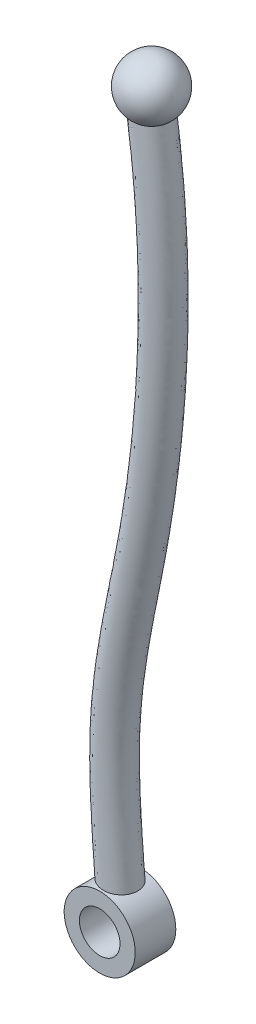
ISO-10303-21;
HEADER;
FILE_DESCRIPTION(('STEP AP214'),'2;1');
FILE_NAME('part.step','',(''),(''),'','','');
FILE_SCHEMA(('AUTOMOTIVE_DESIGN { 1 0 10303 214 1 1 1 1 }'));
ENDSEC;
DATA;
#1=APPLICATION_CONTEXT('core data for automotive mechanical design processes');
#2=APPLICATION_PROTOCOL_DEFINITION('international standard','automotive_design',2000,#1);
#3=PRODUCT_CONTEXT('',#1,'mechanical');
#4=PRODUCT('Part','Part','',(#3));
#5=PRODUCT_RELATED_PRODUCT_CATEGORY('part','',(#4));
#6=PRODUCT_DEFINITION_FORMATION('','',#4);
#7=PRODUCT_DEFINITION_CONTEXT('part definition',#1,'design');
#8=PRODUCT_DEFINITION('design','',#6,#7);
#9=PRODUCT_DEFINITION_SHAPE('','',#8);
#10=(LENGTH_UNIT() NAMED_UNIT(*) SI_UNIT(.MILLI.,.METRE.));
#11=(NAMED_UNIT(*) PLANE_ANGLE_UNIT() SI_UNIT($,.RADIAN.));
#12=(NAMED_UNIT(*) SI_UNIT($,.STERADIAN.) SOLID_ANGLE_UNIT());
#13=UNCERTAINTY_MEASURE_WITH_UNIT(LENGTH_MEASURE(1.E-05),#10,'distance_accuracy_value','');
#14=(GEOMETRIC_REPRESENTATION_CONTEXT(3) GLOBAL_UNCERTAINTY_ASSIGNED_CONTEXT((#13)) GLOBAL_UNIT_ASSIGNED_CONTEXT((#10,
#11,#12)) REPRESENTATION_CONTEXT('',''));
#15=CARTESIAN_POINT('',(0.,0.,0.));
#16=DIRECTION('',(0.,0.,1.));
#17=DIRECTION('',(1.,0.,0.));
#18=AXIS2_PLACEMENT_3D('',#15,#16,#17);
#19=CARTESIAN_POINT('',(0.,-7.,3.86221657162284));
#20=DIRECTION('',(0.,-1.,0.));
#21=DIRECTION('',(0.,0.,-1.));
#22=AXIS2_PLACEMENT_3D('',#19,#20,#21);
#23=PLANE('',#22);
#24=CARTESIAN_POINT('',(0.,-7.,4.));
#25=DIRECTION('',(0.,1.,0.));
#26=DIRECTION('',(0.,0.,1.));
#27=AXIS2_PLACEMENT_3D('',#24,#25,#26);
#28=CIRCLE('',#27,0.137783428377159);
#29=CARTESIAN_POINT('',(0.,-7.,4.13778342837716));
#30=VERTEX_POINT('',#29);
#31=EDGE_CURVE('E66',#30,#30,#28,.T.);
#32=ORIENTED_EDGE('',*,*,#31,.T.);
#33=EDGE_LOOP('',(#32));
#34=FACE_BOUND('',#33,.T.);
#35=ADVANCED_FACE('F60',(#34),#23,.F.);
#36=CARTESIAN_POINT('',(0.,-7.1945013331869,4.));
#37=DIRECTION('',(0.,1.,0.));
#38=DIRECTION('',(0.,0.,1.));
#39=AXIS2_PLACEMENT_3D('',#36,#37,#38);
#40=PLANE('',#39);
#41=CARTESIAN_POINT('',(0.,-7.1945013331869,4.));
#42=DIRECTION('',(0.,1.,0.));
#43=DIRECTION('',(0.,0.,1.));
#44=AXIS2_PLACEMENT_3D('',#41,#42,#43);
#45=CIRCLE('',#44,0.137783428377159);
#46=CARTESIAN_POINT('',(0.,-7.1945013331869,4.13778342837716));
#47=VERTEX_POINT('',#46);
#48=EDGE_CURVE('E12',#47,#47,#45,.T.);
#49=ORIENTED_EDGE('',*,*,#48,.F.);
#50=EDGE_LOOP('',(#49));
#51=FACE_BOUND('',#50,.T.);
#52=ADVANCED_FACE('F75',(#51),#40,.F.);
#53=CARTESIAN_POINT('',(0.,-7.,4.));
#54=DIRECTION('',(0.,1.,0.));
#55=DIRECTION('',(0.,0.,1.));
#56=AXIS2_PLACEMENT_3D('',#53,#54,#55);
#57=CYLINDRICAL_SURFACE('',#56,0.137783428377159);
#58=ORIENTED_EDGE('',*,*,#31,.F.);
#59=EDGE_LOOP('',(#58));
#60=FACE_BOUND('',#59,.T.);
#61=ORIENTED_EDGE('',*,*,#48,.T.);
#62=EDGE_LOOP('',(#61));
#63=FACE_BOUND('',#62,.T.);
#64=ADVANCED_FACE('F73',(#60,#63),#57,.T.);
#65=CLOSED_SHELL('',(#35,#52,#64));
#66=MANIFOLD_SOLID_BREP('B2',#65);
#67=CARTESIAN_POINT('',(0.,0.,8.));
#68=DIRECTION('',(0.,0.,-1.));
#69=DIRECTION('',(-1.,0.,0.));
#70=AXIS2_PLACEMENT_3D('',#67,#68,#69);
#71=CYLINDRICAL_SURFACE('',#70,7.);
#72=CARTESIAN_POINT('',(0.,0.,0.));
#73=DIRECTION('',(0.,0.,1.));
#74=DIRECTION('',(1.,0.,0.));
#75=AXIS2_PLACEMENT_3D('',#72,#73,#74);
#76=CIRCLE('',#75,7.);
#77=CARTESIAN_POINT('',(7.,0.,0.));
#78=VERTEX_POINT('',#77);
#79=EDGE_CURVE('E146',#78,#78,#76,.T.);
#80=ORIENTED_EDGE('',*,*,#79,.T.);
#81=EDGE_LOOP('',(#80));
#82=FACE_BOUND('',#81,.T.);
#83=CARTESIAN_POINT('',(0.,0.,8.));
#84=DIRECTION('',(0.,0.,1.));
#85=DIRECTION('',(1.,0.,0.));
#86=AXIS2_PLACEMENT_3D('',#83,#84,#85);
#87=CIRCLE('',#86,7.);
#88=CARTESIAN_POINT('',(7.,0.,8.));
#89=VERTEX_POINT('',#88);
#90=EDGE_CURVE('E135',#89,#89,#87,.T.);
#91=ORIENTED_EDGE('',*,*,#90,.F.);
#92=EDGE_LOOP('',(#91));
#93=FACE_BOUND('',#92,.T.);
#94=CARTESIAN_POINT('',(2.42365806243927E-09,7.,7.5));
#95=CARTESIAN_POINT('',(0.0422400356138431,7.00000076805746,7.50000073274698));
#96=CARTESIAN_POINT('',(0.0844796114102227,6.9996176935888,7.49922288932425));
#97=CARTESIAN_POINT('',(0.16868741892609,6.99809306650622,7.49612927228377));
#98=CARTESIAN_POINT('',(0.210655985432426,6.99695513154904,7.49382083404208));
#99=CARTESIAN_POINT('',(0.294323815693168,6.99393459760473,7.4876945756797));
#100=CARTESIAN_POINT('',(0.336023511149844,6.99205433473992,7.48388149073423));
#101=CARTESIAN_POINT('',(0.419155721375281,6.98756312538778,7.47476917137856));
#102=CARTESIAN_POINT('',(0.460588547421802,6.98495330180796,7.46947222084216));
#103=CARTESIAN_POINT('',(0.54318327893848,6.97901612384671,7.45740978161843));
#104=CARTESIAN_POINT('',(0.584345213643453,6.97568884824667,7.45064445416889));
#105=CARTESIAN_POINT('',(0.666408373617677,6.96832834444628,7.43565524670615));
#106=CARTESIAN_POINT('',(0.707309068106672,6.96429398061942,7.42742902011428));
#107=CARTESIAN_POINT('',(0.788851812160291,6.95553010718593,7.40952236378143));
#108=CARTESIAN_POINT('',(0.829492642778194,6.95079845000549,7.39983743933177));
#109=CARTESIAN_POINT('',(0.910517436434897,6.94065089772847,7.37901231997466));
#110=CARTESIAN_POINT('',(0.950899335048052,6.93523193208417,7.36786558633951));
#111=CARTESIAN_POINT('',(0.991029119954068,6.92949213713946,7.35602293267703));
#112=B_SPLINE_CURVE_WITH_KNOTS('',3,(#94,#95,#96,#97,#98,#99,#100,#101,#102,#103,#104,#105,#106,
#107,#108,#109,#110,#111),.UNSPECIFIED.,.F.,.F.,(4,2,2,2,2,2,2,2,4),(0.,0.126710488419665,
0.252818064152274,0.378531900178072,0.504053298430019,0.629560920543931,0.755271994166555,
0.881378662671853,1.00806998450979),.UNSPECIFIED.);
#113=CARTESIAN_POINT('',(0.,7.,7.5));
#114=VERTEX_POINT('',#113);
#115=CARTESIAN_POINT('',(0.991029122350048,6.92949213713776,7.35602293197301));
#116=VERTEX_POINT('',#115);
#117=EDGE_CURVE('E58',#114,#116,#112,.T.);
#118=ORIENTED_EDGE('',*,*,#117,.F.);
#119=DIRECTION('',(0.,0.,-1.));
#120=VECTOR('',#119,1.);
#121=CARTESIAN_POINT('',(0.,7.,8.));
#122=LINE('',#121,#120);
#123=CARTESIAN_POINT('',(0.,7.,0.500000000000001));
#124=VERTEX_POINT('',#123);
#125=EDGE_CURVE('E109',#114,#124,#122,.T.);
#126=ORIENTED_EDGE('',*,*,#125,.T.);
#127=CARTESIAN_POINT('',(0.99102911996432,6.92949213747896,0.643977067322961));
#128=CARTESIAN_POINT('',(0.950899335035006,6.93523193220807,0.632134413655968));
#129=CARTESIAN_POINT('',(0.910517436414653,6.94065089776374,0.620987680019741));
#130=CARTESIAN_POINT('',(0.829492642755576,6.95079844997574,0.600162560662808));
#131=CARTESIAN_POINT('',(0.788851812142409,6.95553010717923,0.590477636214458));
#132=CARTESIAN_POINT('',(0.707309068095003,6.96429398062927,0.572570979883343));
#133=CARTESIAN_POINT('',(0.6664083736075,6.96832834444972,0.5643447532919));
#134=CARTESIAN_POINT('',(0.584345213637771,6.97568884824466,0.549355545830163));
#135=CARTESIAN_POINT('',(0.543183278935804,6.97901612384566,0.54259021838118));
#136=CARTESIAN_POINT('',(0.460588547423475,6.98495330180909,0.530527779158093));
#137=CARTESIAN_POINT('',(0.41915572137829,6.98756312539012,0.52523082862183));
#138=CARTESIAN_POINT('',(0.336023511156024,6.99205433473708,0.516118509266392));
#139=CARTESIAN_POINT('',(0.294323815701186,6.99393459759551,0.512305424321015));
#140=CARTESIAN_POINT('',(0.210655985444895,6.99695513155755,0.506179165958709));
#141=CARTESIAN_POINT('',(0.168687418941174,6.99809306653893,0.503870727716985));
#142=CARTESIAN_POINT('',(0.0844796114269324,6.99961769355535,0.50077711067617));
#143=CARTESIAN_POINT('',(0.042240035629553,7.00000076793306,0.499999267253231));
#144=CARTESIAN_POINT('',(2.43718194990733E-09,6.99999999965321,0.500000000000002));
#145=B_SPLINE_CURVE_WITH_KNOTS('',3,(#127,#128,#129,#130,#131,#132,#133,#134,#135,#136,#137,
#138,#139,#140,#141,#142,#143,#144),.UNSPECIFIED.,.F.,.F.,(4,2,2,2,2,2,2,2,4),(0.,
0.126691321825357,0.252797990324944,0.378509063940461,0.504016686045815,0.629538084293607,
0.755251920313766,0.881359496039202,1.0080699844594),.UNSPECIFIED.);
#146=CARTESIAN_POINT('',(0.99102911996432,6.92949213747896,0.643977067322961));
#147=VERTEX_POINT('',#146);
#148=EDGE_CURVE('E124',#147,#124,#145,.T.);
#149=ORIENTED_EDGE('',*,*,#148,.F.);
#150=DIRECTION('',(0.,0.,-1.));
#151=VECTOR('',#150,1.);
#152=CARTESIAN_POINT('',(0.991029122350048,6.92949213713776,8.));
#153=LINE('',#152,#151);
#154=EDGE_CURVE('E119',#147,#116,#153,.F.);
#155=ORIENTED_EDGE('',*,*,#154,.T.);
#156=EDGE_LOOP('',(#118,#126,#149,#155));
#157=FACE_BOUND('',#156,.T.);
#158=ADVANCED_FACE('F100',(#82,#93,#157),#71,.T.);
#159=CARTESIAN_POINT('',(0.,0.,8.));
#160=DIRECTION('',(0.,0.,1.));
#161=DIRECTION('',(1.,0.,0.));
#162=AXIS2_PLACEMENT_3D('',#159,#160,#161);
#163=PLANE('',#162);
#164=CARTESIAN_POINT('',(0.,0.,8.));
#165=DIRECTION('',(0.,0.,1.));
#166=DIRECTION('',(1.,0.,0.));
#167=AXIS2_PLACEMENT_3D('',#164,#165,#166);
#168=CIRCLE('',#167,4.);
#169=CARTESIAN_POINT('',(4.,0.,8.));
#170=VERTEX_POINT('',#169);
#171=EDGE_CURVE('E138',#170,#170,#168,.T.);
#172=ORIENTED_EDGE('',*,*,#171,.F.);
#173=EDGE_LOOP('',(#172));
#174=FACE_BOUND('',#173,.T.);
#175=ORIENTED_EDGE('',*,*,#90,.T.);
#176=EDGE_LOOP('',(#175));
#177=FACE_BOUND('',#176,.T.);
#178=ADVANCED_FACE('F182',(#174,#177),#163,.T.);
#179=CARTESIAN_POINT('',(0.,0.,0.));
#180=DIRECTION('',(0.,0.,1.));
#181=DIRECTION('',(1.,0.,0.));
#182=AXIS2_PLACEMENT_3D('',#179,#180,#181);
#183=PLANE('',#182);
#184=CARTESIAN_POINT('',(0.,0.,0.));
#185=DIRECTION('',(0.,0.,1.));
#186=DIRECTION('',(1.,0.,0.));
#187=AXIS2_PLACEMENT_3D('',#184,#185,#186);
#188=CIRCLE('',#187,4.);
#189=CARTESIAN_POINT('',(4.,0.,0.));
#190=VERTEX_POINT('',#189);
#191=EDGE_CURVE('E141',#190,#190,#188,.F.);
#192=ORIENTED_EDGE('',*,*,#191,.F.);
#193=EDGE_LOOP('',(#192));
#194=FACE_BOUND('',#193,.T.);
#195=ORIENTED_EDGE('',*,*,#79,.F.);
#196=EDGE_LOOP('',(#195));
#197=FACE_BOUND('',#196,.T.);
#198=ADVANCED_FACE('F180',(#194,#197),#183,.F.);
#199=CARTESIAN_POINT('',(0.,0.,-0.000999999999999265));
#200=DIRECTION('',(0.,0.,1.));
#201=DIRECTION('',(1.,0.,0.));
#202=AXIS2_PLACEMENT_3D('',#199,#200,#201);
#203=CYLINDRICAL_SURFACE('',#202,4.);
#204=ORIENTED_EDGE('',*,*,#171,.T.);
#205=EDGE_LOOP('',(#204));
#206=FACE_BOUND('',#205,.T.);
#207=ORIENTED_EDGE('',*,*,#191,.T.);
#208=EDGE_LOOP('',(#207));
#209=FACE_BOUND('',#208,.T.);
#210=ADVANCED_FACE('F177',(#206,#209),#203,.F.);
#211=CARTESIAN_POINT('',(0.,7.,0.500000000000002));
#212=DIRECTION('',(-0.0709667240242291,-0.997478683522244,0.));
#213=DIRECTION('',(0.997478683522244,-0.0709667240242291,0.));
#214=AXIS2_PLACEMENT_3D('',#211,#212,#213);
#215=PLANE('',#214);
#216=ORIENTED_EDGE('',*,*,#125,.F.);
#217=CARTESIAN_POINT('',(0.,7.,4.));
#218=DIRECTION('',(-0.0709667240242293,-0.997478683522244,0.));
#219=DIRECTION('',(0.997478683522244,-0.0709667240242293,0.));
#220=AXIS2_PLACEMENT_3D('',#217,#218,#219);
#221=CIRCLE('',#220,3.5);
#222=EDGE_CURVE('E132',#114,#124,#221,.T.);
#223=ORIENTED_EDGE('',*,*,#222,.T.);
#224=EDGE_LOOP('',(#216,#223));
#225=FACE_BOUND('',#224,.T.);
#226=ADVANCED_FACE('F137',(#225),#215,.T.);
#227=ORIENTED_EDGE('',*,*,#154,.F.);
#228=EDGE_CURVE('E134',#147,#116,#221,.T.);
#229=ORIENTED_EDGE('',*,*,#228,.T.);
#230=EDGE_LOOP('',(#227,#229));
#231=FACE_BOUND('',#230,.T.);
#232=ADVANCED_FACE('F163',(#231),#215,.T.);
#233=CARTESIAN_POINT('',(6.224984939727,141.094605048668,7.5));
#234=CARTESIAN_POINT('',(8.09432476081943,128.630208187559,7.5));
#235=CARTESIAN_POINT('',(9.44096568560838,103.771910499148,7.5));
#236=CARTESIAN_POINT('',(6.66384074897124,78.6200375004063,7.5));
#237=CARTESIAN_POINT('',(2.5469197670364,56.4457829138081,7.5));
#238=CARTESIAN_POINT('',(0.0620829769121219,46.1202623797454,7.5));
#239=CARTESIAN_POINT('',(-1.50982652551515,26.4687052489353,7.5));
#240=CARTESIAN_POINT('',(-0.739284176276744,16.4784859307159,7.5));
#241=CARTESIAN_POINT('',(0.,7.,7.5));
#242=CARTESIAN_POINT('',(13.224984939727,141.094605048668,7.5));
#243=CARTESIAN_POINT('',(15.0866477033076,128.247737728982,7.5));
#244=CARTESIAN_POINT('',(16.41814416546,102.634943990425,7.5));
#245=CARTESIAN_POINT('',(13.2800004350651,76.3541547611059,7.5));
#246=CARTESIAN_POINT('',(9.15682447452879,54.1266065140505,7.5));
#247=CARTESIAN_POINT('',(6.79492610185322,44.1529221818994,7.5));
#248=CARTESIAN_POINT('',(5.38186652066269,25.2166333266626,7.5));
#249=CARTESIAN_POINT('',(6.19851362427875,15.6105306361393,7.5));
#250=CARTESIAN_POINT('',(6.98235078465571,6.5032329318304,7.5));
#251=CARTESIAN_POINT('',(13.224984939727,141.094605048668,0.500000000000001));
#252=CARTESIAN_POINT('',(15.0866477033076,128.247737728982,0.500000000000001));
#253=CARTESIAN_POINT('',(16.41814416546,102.634943990425,0.499999999999999));
#254=CARTESIAN_POINT('',(13.2800004350651,76.3541547611059,0.500000000000001));
#255=CARTESIAN_POINT('',(9.15682447452879,54.1266065140505,0.500000000000003));
#256=CARTESIAN_POINT('',(6.79492610185322,44.1529221818994,0.500000000000004));
#257=CARTESIAN_POINT('',(5.38186652066269,25.2166333266626,0.500000000000004));
#258=CARTESIAN_POINT('',(6.19851362427875,15.6105306361393,0.500000000000004));
#259=CARTESIAN_POINT('',(6.98235078465571,6.5032329318304,0.500000000000003));
#260=CARTESIAN_POINT('',(6.224984939727,141.094605048668,0.5));
#261=CARTESIAN_POINT('',(8.09432476081943,128.630208187559,0.5));
#262=CARTESIAN_POINT('',(9.44096568560838,103.771910499148,0.499999999999998));
#263=CARTESIAN_POINT('',(6.66384074897124,78.6200375004063,0.5));
#264=CARTESIAN_POINT('',(2.5469197670364,56.4457829138081,0.500000000000002));
#265=CARTESIAN_POINT('',(0.0620829769121219,46.1202623797454,0.500000000000003));
#266=CARTESIAN_POINT('',(-1.50982652551515,26.4687052489353,0.500000000000003));
#267=CARTESIAN_POINT('',(-0.739284176276744,16.4784859307159,0.500000000000003));
#268=CARTESIAN_POINT('',(0.,7.,0.500000000000002));
#269=CARTESIAN_POINT('',(-0.775015060272995,141.094605048668,0.499999999999999));
#270=CARTESIAN_POINT('',(1.10200181833132,129.012678646135,0.499999999999999));
#271=CARTESIAN_POINT('',(2.46378720575675,104.908877007871,0.499999999999997));
#272=CARTESIAN_POINT('',(0.0476810628774123,80.8859202397068,0.499999999999999));
#273=CARTESIAN_POINT('',(-4.062984940456,58.7649593135658,0.500000000000001));
#274=CARTESIAN_POINT('',(-6.67076014802897,48.0876025775913,0.500000000000003));
#275=CARTESIAN_POINT('',(-8.40151957169297,27.7207771712078,0.500000000000003));
#276=CARTESIAN_POINT('',(-7.67708197683223,17.3464412252924,0.500000000000003));
#277=CARTESIAN_POINT('',(-6.98235078465571,7.49676706816957,0.500000000000001));
#278=CARTESIAN_POINT('',(-0.775015060272995,141.094605048668,7.5));
#279=CARTESIAN_POINT('',(1.10200181833132,129.012678646135,7.5));
#280=CARTESIAN_POINT('',(2.46378720575675,104.908877007871,7.5));
#281=CARTESIAN_POINT('',(0.0476810628774123,80.8859202397068,7.5));
#282=CARTESIAN_POINT('',(-4.062984940456,58.7649593135658,7.5));
#283=CARTESIAN_POINT('',(-6.67076014802897,48.0876025775913,7.5));
#284=CARTESIAN_POINT('',(-8.40151957169297,27.7207771712078,7.5));
#285=CARTESIAN_POINT('',(-7.67708197683223,17.3464412252924,7.5));
#286=CARTESIAN_POINT('',(-6.98235078465571,7.49676706816957,7.5));
#287=CARTESIAN_POINT('',(6.224984939727,141.094605048668,7.5));
#288=CARTESIAN_POINT('',(8.09432476081943,128.630208187559,7.5));
#289=CARTESIAN_POINT('',(9.44096568560838,103.771910499148,7.5));
#290=CARTESIAN_POINT('',(6.66384074897124,78.6200375004063,7.5));
#291=CARTESIAN_POINT('',(2.5469197670364,56.4457829138081,7.5));
#292=CARTESIAN_POINT('',(0.0620829769121219,46.1202623797454,7.5));
#293=CARTESIAN_POINT('',(-1.50982652551515,26.4687052489353,7.5));
#294=CARTESIAN_POINT('',(-0.739284176276744,16.4784859307159,7.5));
#295=CARTESIAN_POINT('',(0.,7.,7.5));
#296=(BOUNDED_SURFACE() B_SPLINE_SURFACE(3,3,((#233,#234,#235,#236,#237,#238,#239,#240,#241),
(#242,#243,#244,#245,#246,#247,#248,#249,#250),(#251,#252,#253,#254,#255,#256,#257,#258,#259),
(#260,#261,#262,#263,#264,#265,#266,#267,#268),(#269,#270,#271,#272,#273,#274,#275,#276,#277),
(#278,#279,#280,#281,#282,#283,#284,#285,#286),(#287,#288,#289,#290,#291,#292,#293,#294,#295)),
.UNSPECIFIED.,.T.,.F.,.F.) B_SPLINE_SURFACE_WITH_KNOTS((4,3,4),(4,1,1,1,1,1,4),(0.,0.5,1.),(0.,
0.28,0.552353493724002,0.56,0.78,0.787404647647404,1.),
.UNSPECIFIED.) GEOMETRIC_REPRESENTATION_ITEM() RATIONAL_B_SPLINE_SURFACE(((1.,1.,1.,1.,1.,1.,1.,
1.,1.),(0.333333333333333,0.333333333333333,0.333333333333333,0.333333333333333,
0.333333333333333,0.333333333333333,0.333333333333333,0.333333333333333,0.333333333333333),
(0.333333333333333,0.333333333333333,0.333333333333333,0.333333333333333,0.333333333333333,
0.333333333333333,0.333333333333333,0.333333333333333,0.333333333333333),(1.,1.,1.,1.,1.,1.,1.,
1.,1.),(0.333333333333333,0.333333333333333,0.333333333333333,0.333333333333333,
0.333333333333333,0.333333333333333,0.333333333333333,0.333333333333333,0.333333333333333),
(0.333333333333333,0.333333333333333,0.333333333333333,0.333333333333333,0.333333333333333,
0.333333333333333,0.333333333333333,0.333333333333333,0.333333333333333),(1.,1.,1.,1.,1.,1.,1.,
1.,1.))) REPRESENTATION_ITEM('') SURFACE());
#297=CARTESIAN_POINT('',(6.224984939727,141.094605048668,4.));
#298=DIRECTION('',(0.,1.,0.));
#299=DIRECTION('',(0.,0.,1.));
#300=AXIS2_PLACEMENT_3D('',#297,#298,#299);
#301=CIRCLE('',#300,3.5);
#302=CARTESIAN_POINT('',(6.224984939727,141.094605048668,7.5));
#303=VERTEX_POINT('',#302);
#304=EDGE_CURVE('E104',#303,#303,#301,.T.);
#305=ORIENTED_EDGE('',*,*,#304,.F.);
#306=EDGE_LOOP('',(#305));
#307=FACE_BOUND('',#306,.T.);
#308=ORIENTED_EDGE('',*,*,#222,.F.);
#309=ORIENTED_EDGE('',*,*,#117,.T.);
#310=ORIENTED_EDGE('',*,*,#228,.F.);
#311=ORIENTED_EDGE('',*,*,#148,.T.);
#312=EDGE_LOOP('',(#308,#309,#310,#311));
#313=FACE_BOUND('',#312,.T.);
#314=ADVANCED_FACE('F131',(#307,#313),#296,.F.);
#315=CARTESIAN_POINT('',(6.224984939727,145.482105048668,4.));
#316=DIRECTION('',(0.,0.,1.));
#317=DIRECTION('',(1.,0.,0.));
#318=AXIS2_PLACEMENT_3D('',#315,#316,#317);
#319=SPHERICAL_SURFACE('',#318,5.6125);
#320=CARTESIAN_POINT('',(6.224984939727,145.482105048668,4.));
#321=DIRECTION('',(0.,1.,0.));
#322=DIRECTION('',(0.,0.,1.));
#323=AXIS2_PLACEMENT_3D('',#320,#321,#322);
#324=SPHERICAL_SURFACE('',#323,5.6125);
#325=ORIENTED_EDGE('',*,*,#304,.T.);
#326=EDGE_LOOP('',(#325));
#327=FACE_BOUND('',#326,.T.);
#328=ADVANCED_FACE('F102',(#327),#324,.T.);
#329=CLOSED_SHELL('',(#158,#178,#198,#210,#226,#232,#314,#328));
#330=MANIFOLD_SOLID_BREP('B7',#329);
#331=ADVANCED_BREP_SHAPE_REPRESENTATION('',(#18,#66,#330),#14);
#332=SHAPE_DEFINITION_REPRESENTATION(#9,#331);
ENDSEC;
END-ISO-10303-21;
